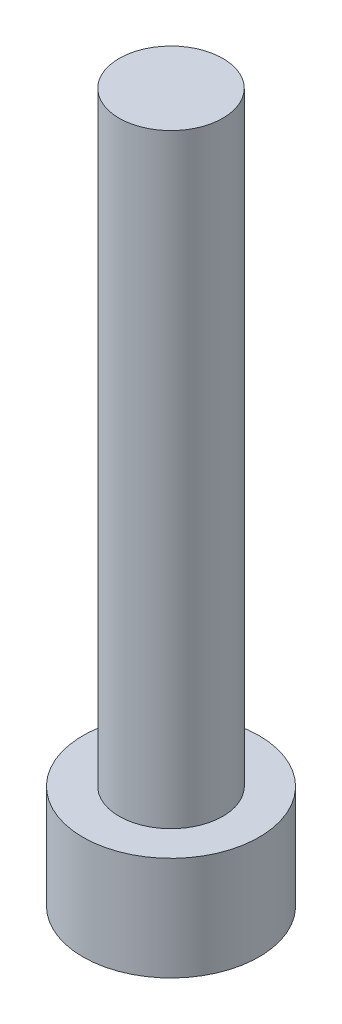
ISO-10303-21;
HEADER;
FILE_DESCRIPTION(('STEP AP214'),'2;1');
FILE_NAME('part.step','',(''),(''),'','','');
FILE_SCHEMA(('AUTOMOTIVE_DESIGN { 1 0 10303 214 1 1 1 1 }'));
ENDSEC;
DATA;
#1=APPLICATION_CONTEXT('core data for automotive mechanical design processes');
#2=APPLICATION_PROTOCOL_DEFINITION('international standard','automotive_design',2000,#1);
#3=PRODUCT_CONTEXT('',#1,'mechanical');
#4=PRODUCT('Part','Part','',(#3));
#5=PRODUCT_RELATED_PRODUCT_CATEGORY('part','',(#4));
#6=PRODUCT_DEFINITION_FORMATION('','',#4);
#7=PRODUCT_DEFINITION_CONTEXT('part definition',#1,'design');
#8=PRODUCT_DEFINITION('design','',#6,#7);
#9=PRODUCT_DEFINITION_SHAPE('','',#8);
#10=(LENGTH_UNIT() NAMED_UNIT(*) SI_UNIT(.MILLI.,.METRE.));
#11=(NAMED_UNIT(*) PLANE_ANGLE_UNIT() SI_UNIT($,.RADIAN.));
#12=(NAMED_UNIT(*) SI_UNIT($,.STERADIAN.) SOLID_ANGLE_UNIT());
#13=UNCERTAINTY_MEASURE_WITH_UNIT(LENGTH_MEASURE(1.E-05),#10,'distance_accuracy_value','');
#14=(GEOMETRIC_REPRESENTATION_CONTEXT(3) GLOBAL_UNCERTAINTY_ASSIGNED_CONTEXT((#13)) GLOBAL_UNIT_ASSIGNED_CONTEXT((#10,
#11,#12)) REPRESENTATION_CONTEXT('',''));
#15=CARTESIAN_POINT('',(0.,0.,0.));
#16=DIRECTION('',(0.,0.,1.));
#17=DIRECTION('',(1.,0.,0.));
#18=AXIS2_PLACEMENT_3D('',#15,#16,#17);
#19=CARTESIAN_POINT('',(0.,6.,0.));
#20=DIRECTION('',(0.,-1.,0.));
#21=DIRECTION('',(0.,0.,-1.));
#22=AXIS2_PLACEMENT_3D('',#19,#20,#21);
#23=CYLINDRICAL_SURFACE('',#22,5.1);
#24=CARTESIAN_POINT('',(0.,6.,0.));
#25=DIRECTION('',(0.,1.,0.));
#26=DIRECTION('',(0.,0.,1.));
#27=AXIS2_PLACEMENT_3D('',#24,#25,#26);
#28=CIRCLE('',#27,5.1);
#29=CARTESIAN_POINT('',(0.,6.,5.1));
#30=VERTEX_POINT('',#29);
#31=EDGE_CURVE('E45',#30,#30,#28,.T.);
#32=ORIENTED_EDGE('',*,*,#31,.F.);
#33=EDGE_LOOP('',(#32));
#34=FACE_BOUND('',#33,.T.);
#35=CARTESIAN_POINT('',(0.,0.,0.));
#36=DIRECTION('',(0.,1.,0.));
#37=DIRECTION('',(0.,0.,1.));
#38=AXIS2_PLACEMENT_3D('',#35,#36,#37);
#39=CIRCLE('',#38,5.1);
#40=CARTESIAN_POINT('',(0.,0.,5.1));
#41=VERTEX_POINT('',#40);
#42=EDGE_CURVE('E40',#41,#41,#39,.T.);
#43=ORIENTED_EDGE('',*,*,#42,.T.);
#44=EDGE_LOOP('',(#43));
#45=FACE_BOUND('',#44,.T.);
#46=ADVANCED_FACE('F37',(#34,#45),#23,.T.);
#47=CARTESIAN_POINT('',(0.,6.,0.));
#48=DIRECTION('',(0.,1.,0.));
#49=DIRECTION('',(0.,0.,1.));
#50=AXIS2_PLACEMENT_3D('',#47,#48,#49);
#51=PLANE('',#50);
#52=CARTESIAN_POINT('',(0.,6.,0.));
#53=DIRECTION('',(0.,1.,0.));
#54=DIRECTION('',(0.,0.,1.));
#55=AXIS2_PLACEMENT_3D('',#52,#53,#54);
#56=CIRCLE('',#55,3.);
#57=CARTESIAN_POINT('',(0.,6.,3.));
#58=VERTEX_POINT('',#57);
#59=EDGE_CURVE('E10',#58,#58,#56,.T.);
#60=ORIENTED_EDGE('',*,*,#59,.F.);
#61=EDGE_LOOP('',(#60));
#62=FACE_BOUND('',#61,.T.);
#63=ORIENTED_EDGE('',*,*,#31,.T.);
#64=EDGE_LOOP('',(#63));
#65=FACE_BOUND('',#64,.T.);
#66=ADVANCED_FACE('F65',(#62,#65),#51,.T.);
#67=CARTESIAN_POINT('',(0.,0.,0.));
#68=DIRECTION('',(0.,1.,0.));
#69=DIRECTION('',(0.,0.,1.));
#70=AXIS2_PLACEMENT_3D('',#67,#68,#69);
#71=PLANE('',#70);
#72=ORIENTED_EDGE('',*,*,#42,.F.);
#73=EDGE_LOOP('',(#72));
#74=FACE_BOUND('',#73,.T.);
#75=ADVANCED_FACE('F62',(#74),#71,.F.);
#76=CARTESIAN_POINT('',(0.,41.,0.));
#77=DIRECTION('',(0.,-1.,0.));
#78=DIRECTION('',(0.,0.,-1.));
#79=AXIS2_PLACEMENT_3D('',#76,#77,#78);
#80=CYLINDRICAL_SURFACE('',#79,3.);
#81=CARTESIAN_POINT('',(0.,41.,0.));
#82=DIRECTION('',(0.,1.,0.));
#83=DIRECTION('',(0.,0.,1.));
#84=AXIS2_PLACEMENT_3D('',#81,#82,#83);
#85=CIRCLE('',#84,3.);
#86=CARTESIAN_POINT('',(0.,41.,3.));
#87=VERTEX_POINT('',#86);
#88=EDGE_CURVE('E52',#87,#87,#85,.T.);
#89=ORIENTED_EDGE('',*,*,#88,.F.);
#90=EDGE_LOOP('',(#89));
#91=FACE_BOUND('',#90,.T.);
#92=ORIENTED_EDGE('',*,*,#59,.T.);
#93=EDGE_LOOP('',(#92));
#94=FACE_BOUND('',#93,.T.);
#95=ADVANCED_FACE('F64',(#91,#94),#80,.T.);
#96=CARTESIAN_POINT('',(0.,41.,0.));
#97=DIRECTION('',(0.,1.,0.));
#98=DIRECTION('',(0.,0.,1.));
#99=AXIS2_PLACEMENT_3D('',#96,#97,#98);
#100=PLANE('',#99);
#101=ORIENTED_EDGE('',*,*,#88,.T.);
#102=EDGE_LOOP('',(#101));
#103=FACE_BOUND('',#102,.T.);
#104=ADVANCED_FACE('F70',(#103),#100,.T.);
#105=CLOSED_SHELL('',(#46,#66,#75,#95,#104));
#106=MANIFOLD_SOLID_BREP('B2',#105);
#107=ADVANCED_BREP_SHAPE_REPRESENTATION('',(#18,#106),#14);
#108=SHAPE_DEFINITION_REPRESENTATION(#9,#107);
ENDSEC;
END-ISO-10303-21;
